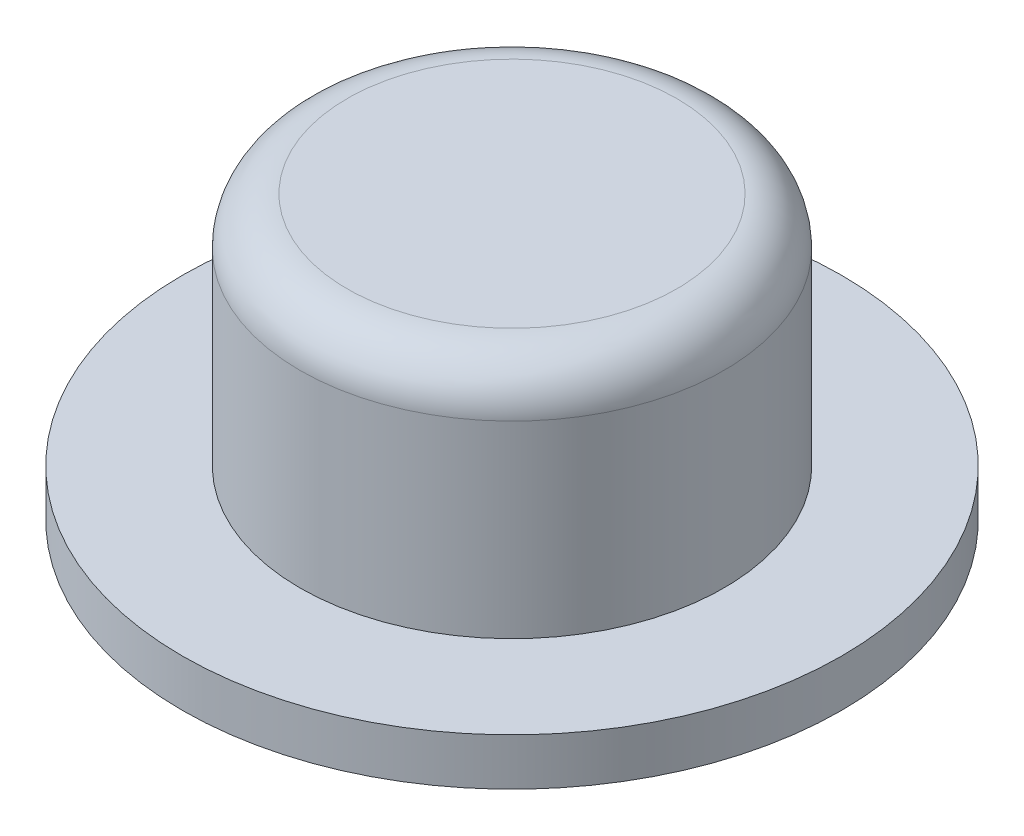
ISO-10303-21;
HEADER;
FILE_DESCRIPTION(('STEP AP214'),'2;1');
FILE_NAME('part.step','',(''),(''),'','','');
FILE_SCHEMA(('AUTOMOTIVE_DESIGN { 1 0 10303 214 1 1 1 1 }'));
ENDSEC;
DATA;
#1=APPLICATION_CONTEXT('core data for automotive mechanical design processes');
#2=APPLICATION_PROTOCOL_DEFINITION('international standard','automotive_design',2000,#1);
#3=PRODUCT_CONTEXT('',#1,'mechanical');
#4=PRODUCT('Part','Part','',(#3));
#5=PRODUCT_RELATED_PRODUCT_CATEGORY('part','',(#4));
#6=PRODUCT_DEFINITION_FORMATION('','',#4);
#7=PRODUCT_DEFINITION_CONTEXT('part definition',#1,'design');
#8=PRODUCT_DEFINITION('design','',#6,#7);
#9=PRODUCT_DEFINITION_SHAPE('','',#8);
#10=(LENGTH_UNIT() NAMED_UNIT(*) SI_UNIT(.MILLI.,.METRE.));
#11=(NAMED_UNIT(*) PLANE_ANGLE_UNIT() SI_UNIT($,.RADIAN.));
#12=(NAMED_UNIT(*) SI_UNIT($,.STERADIAN.) SOLID_ANGLE_UNIT());
#13=UNCERTAINTY_MEASURE_WITH_UNIT(LENGTH_MEASURE(1.E-05),#10,'distance_accuracy_value','');
#14=(GEOMETRIC_REPRESENTATION_CONTEXT(3) GLOBAL_UNCERTAINTY_ASSIGNED_CONTEXT((#13)) GLOBAL_UNIT_ASSIGNED_CONTEXT((#10,
#11,#12)) REPRESENTATION_CONTEXT('',''));
#15=CARTESIAN_POINT('',(0.,0.,0.));
#16=DIRECTION('',(0.,0.,1.));
#17=DIRECTION('',(1.,0.,0.));
#18=AXIS2_PLACEMENT_3D('',#15,#16,#17);
#19=CARTESIAN_POINT('',(0.,6.,0.));
#20=DIRECTION('',(0.,-1.,0.));
#21=DIRECTION('',(0.,0.,-1.));
#22=AXIS2_PLACEMENT_3D('',#19,#20,#21);
#23=PLANE('',#22);
#24=CARTESIAN_POINT('',(0.,6.,0.));
#25=DIRECTION('',(0.,-1.,0.));
#26=DIRECTION('',(0.,0.,-1.));
#27=AXIS2_PLACEMENT_3D('',#24,#25,#26);
#28=CIRCLE('',#27,3.49999999999999);
#29=CARTESIAN_POINT('',(0.,6.,-3.49999999999999));
#30=VERTEX_POINT('',#29);
#31=EDGE_CURVE('E10',#30,#30,#28,.T.);
#32=ORIENTED_EDGE('',*,*,#31,.F.);
#33=EDGE_LOOP('',(#32));
#34=FACE_BOUND('',#33,.T.);
#35=ADVANCED_FACE('F43',(#34),#23,.F.);
#36=CARTESIAN_POINT('',(0.,5.,0.));
#37=DIRECTION('',(0.,-1.,0.));
#38=DIRECTION('',(0.,0.,-1.));
#39=AXIS2_PLACEMENT_3D('',#36,#37,#38);
#40=TOROIDAL_SURFACE('',#39,3.5,1.);
#41=CARTESIAN_POINT('',(0.,4.99999999999999,0.));
#42=DIRECTION('',(0.,-1.,0.));
#43=DIRECTION('',(0.,0.,-1.));
#44=AXIS2_PLACEMENT_3D('',#41,#42,#43);
#45=CIRCLE('',#44,4.5);
#46=CARTESIAN_POINT('',(0.,4.99999999999999,-4.5));
#47=VERTEX_POINT('',#46);
#48=EDGE_CURVE('E50',#47,#47,#45,.T.);
#49=ORIENTED_EDGE('',*,*,#48,.F.);
#50=EDGE_LOOP('',(#49));
#51=FACE_BOUND('',#50,.T.);
#52=ORIENTED_EDGE('',*,*,#31,.T.);
#53=EDGE_LOOP('',(#52));
#54=FACE_BOUND('',#53,.T.);
#55=ADVANCED_FACE('F87',(#51,#54),#40,.T.);
#56=CARTESIAN_POINT('',(0.,0.,0.));
#57=DIRECTION('',(0.,-1.,0.));
#58=DIRECTION('',(0.,0.,-1.));
#59=AXIS2_PLACEMENT_3D('',#56,#57,#58);
#60=CYLINDRICAL_SURFACE('',#59,4.5);
#61=CARTESIAN_POINT('',(0.,1.,0.));
#62=DIRECTION('',(0.,-1.,0.));
#63=DIRECTION('',(0.,0.,-1.));
#64=AXIS2_PLACEMENT_3D('',#61,#62,#63);
#65=CIRCLE('',#64,4.5);
#66=CARTESIAN_POINT('',(0.,1.,-4.5));
#67=VERTEX_POINT('',#66);
#68=EDGE_CURVE('E55',#67,#67,#65,.T.);
#69=ORIENTED_EDGE('',*,*,#68,.F.);
#70=EDGE_LOOP('',(#69));
#71=FACE_BOUND('',#70,.T.);
#72=ORIENTED_EDGE('',*,*,#48,.T.);
#73=EDGE_LOOP('',(#72));
#74=FACE_BOUND('',#73,.T.);
#75=ADVANCED_FACE('F82',(#71,#74),#60,.T.);
#76=CARTESIAN_POINT('',(0.,1.,0.));
#77=DIRECTION('',(0.,-1.,0.));
#78=DIRECTION('',(0.,0.,-1.));
#79=AXIS2_PLACEMENT_3D('',#76,#77,#78);
#80=PLANE('',#79);
#81=CARTESIAN_POINT('',(0.,1.,0.));
#82=DIRECTION('',(0.,-1.,0.));
#83=DIRECTION('',(0.,0.,-1.));
#84=AXIS2_PLACEMENT_3D('',#81,#82,#83);
#85=CIRCLE('',#84,7.);
#86=CARTESIAN_POINT('',(0.,1.,-7.));
#87=VERTEX_POINT('',#86);
#88=EDGE_CURVE('E60',#87,#87,#85,.T.);
#89=ORIENTED_EDGE('',*,*,#88,.F.);
#90=EDGE_LOOP('',(#89));
#91=FACE_BOUND('',#90,.T.);
#92=ORIENTED_EDGE('',*,*,#68,.T.);
#93=EDGE_LOOP('',(#92));
#94=FACE_BOUND('',#93,.T.);
#95=ADVANCED_FACE('F76',(#91,#94),#80,.F.);
#96=CARTESIAN_POINT('',(0.,0.,0.));
#97=DIRECTION('',(0.,-1.,0.));
#98=DIRECTION('',(0.,0.,-1.));
#99=AXIS2_PLACEMENT_3D('',#96,#97,#98);
#100=CYLINDRICAL_SURFACE('',#99,7.);
#101=CARTESIAN_POINT('',(0.,0.,0.));
#102=DIRECTION('',(0.,-1.,0.));
#103=DIRECTION('',(0.,0.,-1.));
#104=AXIS2_PLACEMENT_3D('',#101,#102,#103);
#105=CIRCLE('',#104,7.);
#106=CARTESIAN_POINT('',(0.,0.,-7.));
#107=VERTEX_POINT('',#106);
#108=EDGE_CURVE('E66',#107,#107,#105,.T.);
#109=ORIENTED_EDGE('',*,*,#108,.F.);
#110=EDGE_LOOP('',(#109));
#111=FACE_BOUND('',#110,.T.);
#112=ORIENTED_EDGE('',*,*,#88,.T.);
#113=EDGE_LOOP('',(#112));
#114=FACE_BOUND('',#113,.T.);
#115=ADVANCED_FACE('F73',(#111,#114),#100,.T.);
#116=CARTESIAN_POINT('',(0.,0.,0.));
#117=DIRECTION('',(0.,1.,0.));
#118=DIRECTION('',(0.,0.,1.));
#119=AXIS2_PLACEMENT_3D('',#116,#117,#118);
#120=PLANE('',#119);
#121=ORIENTED_EDGE('',*,*,#108,.T.);
#122=EDGE_LOOP('',(#121));
#123=FACE_BOUND('',#122,.T.);
#124=ADVANCED_FACE('F71',(#123),#120,.F.);
#125=CLOSED_SHELL('',(#35,#55,#75,#95,#115,#124));
#126=MANIFOLD_SOLID_BREP('B2',#125);
#127=ADVANCED_BREP_SHAPE_REPRESENTATION('',(#18,#126),#14);
#128=SHAPE_DEFINITION_REPRESENTATION(#9,#127);
ENDSEC;
END-ISO-10303-21;
